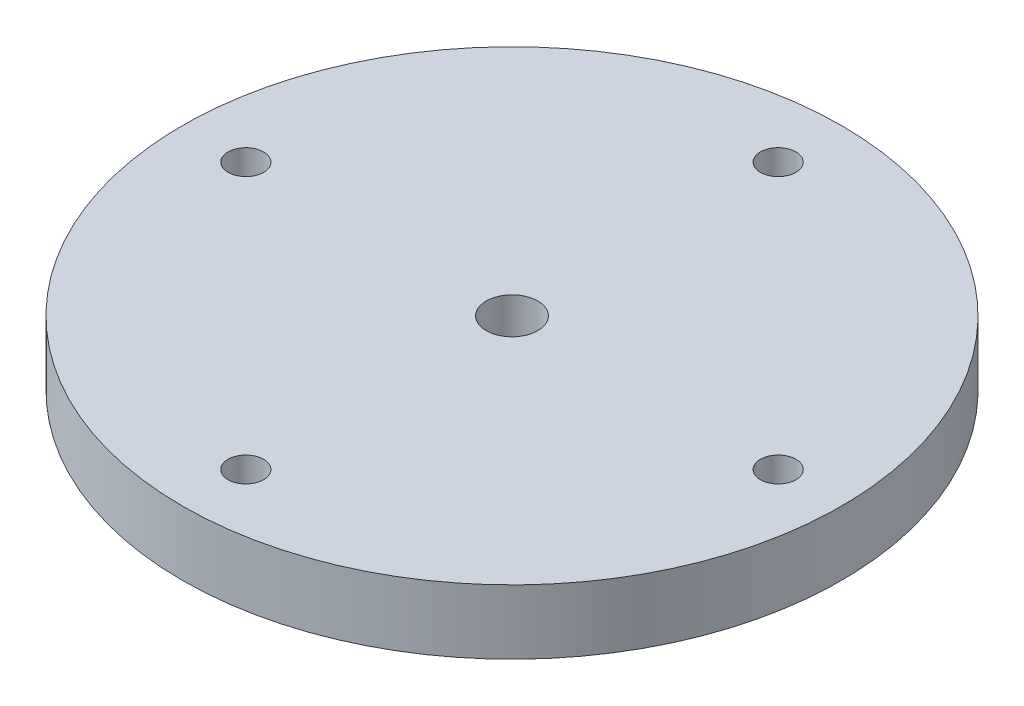
ISO-10303-21;
HEADER;
FILE_DESCRIPTION(('STEP AP214'),'2;1');
FILE_NAME('part.step','',(''),(''),'','','');
FILE_SCHEMA(('AUTOMOTIVE_DESIGN { 1 0 10303 214 1 1 1 1 }'));
ENDSEC;
DATA;
#1=APPLICATION_CONTEXT('core data for automotive mechanical design processes');
#2=APPLICATION_PROTOCOL_DEFINITION('international standard','automotive_design',2000,#1);
#3=PRODUCT_CONTEXT('',#1,'mechanical');
#4=PRODUCT('Part','Part','',(#3));
#5=PRODUCT_RELATED_PRODUCT_CATEGORY('part','',(#4));
#6=PRODUCT_DEFINITION_FORMATION('','',#4);
#7=PRODUCT_DEFINITION_CONTEXT('part definition',#1,'design');
#8=PRODUCT_DEFINITION('design','',#6,#7);
#9=PRODUCT_DEFINITION_SHAPE('','',#8);
#10=(LENGTH_UNIT() NAMED_UNIT(*) SI_UNIT(.MILLI.,.METRE.));
#11=(NAMED_UNIT(*) PLANE_ANGLE_UNIT() SI_UNIT($,.RADIAN.));
#12=(NAMED_UNIT(*) SI_UNIT($,.STERADIAN.) SOLID_ANGLE_UNIT());
#13=UNCERTAINTY_MEASURE_WITH_UNIT(LENGTH_MEASURE(1.E-05),#10,'distance_accuracy_value','');
#14=(GEOMETRIC_REPRESENTATION_CONTEXT(3) GLOBAL_UNCERTAINTY_ASSIGNED_CONTEXT((#13)) GLOBAL_UNIT_ASSIGNED_CONTEXT((#10,
#11,#12)) REPRESENTATION_CONTEXT('',''));
#15=CARTESIAN_POINT('',(0.,0.,0.));
#16=DIRECTION('',(0.,0.,1.));
#17=DIRECTION('',(1.,0.,0.));
#18=AXIS2_PLACEMENT_3D('',#15,#16,#17);
#19=CARTESIAN_POINT('',(0.,6.35,0.));
#20=DIRECTION('',(0.,-1.,0.));
#21=DIRECTION('',(0.,0.,-1.));
#22=AXIS2_PLACEMENT_3D('',#19,#20,#21);
#23=CYLINDRICAL_SURFACE('',#22,32.5);
#24=CARTESIAN_POINT('',(0.,6.35,0.));
#25=DIRECTION('',(0.,1.,0.));
#26=DIRECTION('',(0.,0.,1.));
#27=AXIS2_PLACEMENT_3D('',#24,#25,#26);
#28=CIRCLE('',#27,32.5);
#29=CARTESIAN_POINT('',(0.,6.35,32.5));
#30=VERTEX_POINT('',#29);
#31=EDGE_CURVE('E10',#30,#30,#28,.T.);
#32=ORIENTED_EDGE('',*,*,#31,.F.);
#33=EDGE_LOOP('',(#32));
#34=FACE_BOUND('',#33,.T.);
#35=CARTESIAN_POINT('',(0.,0.,0.));
#36=DIRECTION('',(0.,1.,0.));
#37=DIRECTION('',(0.,0.,1.));
#38=AXIS2_PLACEMENT_3D('',#35,#36,#37);
#39=CIRCLE('',#38,32.5);
#40=CARTESIAN_POINT('',(0.,0.,32.5));
#41=VERTEX_POINT('',#40);
#42=EDGE_CURVE('E39',#41,#41,#39,.T.);
#43=ORIENTED_EDGE('',*,*,#42,.T.);
#44=EDGE_LOOP('',(#43));
#45=FACE_BOUND('',#44,.T.);
#46=ADVANCED_FACE('F36',(#34,#45),#23,.T.);
#47=CARTESIAN_POINT('',(0.,6.35,0.));
#48=DIRECTION('',(0.,1.,0.));
#49=DIRECTION('',(0.,0.,1.));
#50=AXIS2_PLACEMENT_3D('',#47,#48,#49);
#51=PLANE('',#50);
#52=CARTESIAN_POINT('',(0.,6.35,26.25));
#53=DIRECTION('',(0.,1.,0.));
#54=DIRECTION('',(0.,0.,1.));
#55=AXIS2_PLACEMENT_3D('',#52,#53,#54);
#56=CIRCLE('',#55,1.75);
#57=CARTESIAN_POINT('',(0.,6.35,28.));
#58=VERTEX_POINT('',#57);
#59=EDGE_CURVE('E72',#58,#58,#56,.T.);
#60=ORIENTED_EDGE('',*,*,#59,.F.);
#61=EDGE_LOOP('',(#60));
#62=FACE_BOUND('',#61,.T.);
#63=CARTESIAN_POINT('',(26.25,6.35,0.));
#64=DIRECTION('',(0.,1.,0.));
#65=DIRECTION('',(0.,0.,1.));
#66=AXIS2_PLACEMENT_3D('',#63,#64,#65);
#67=CIRCLE('',#66,1.75);
#68=CARTESIAN_POINT('',(26.25,6.35,1.75));
#69=VERTEX_POINT('',#68);
#70=EDGE_CURVE('E66',#69,#69,#67,.T.);
#71=ORIENTED_EDGE('',*,*,#70,.F.);
#72=EDGE_LOOP('',(#71));
#73=FACE_BOUND('',#72,.T.);
#74=CARTESIAN_POINT('',(0.,6.35,-26.25));
#75=DIRECTION('',(0.,1.,0.));
#76=DIRECTION('',(0.,0.,1.));
#77=AXIS2_PLACEMENT_3D('',#74,#75,#76);
#78=CIRCLE('',#77,1.75);
#79=CARTESIAN_POINT('',(0.,6.35,-24.5));
#80=VERTEX_POINT('',#79);
#81=EDGE_CURVE('E60',#80,#80,#78,.T.);
#82=ORIENTED_EDGE('',*,*,#81,.F.);
#83=EDGE_LOOP('',(#82));
#84=FACE_BOUND('',#83,.T.);
#85=CARTESIAN_POINT('',(-26.25,6.35,0.));
#86=DIRECTION('',(0.,1.,0.));
#87=DIRECTION('',(0.,0.,1.));
#88=AXIS2_PLACEMENT_3D('',#85,#86,#87);
#89=CIRCLE('',#88,1.75);
#90=CARTESIAN_POINT('',(-26.25,6.35,1.75));
#91=VERTEX_POINT('',#90);
#92=EDGE_CURVE('E54',#91,#91,#89,.T.);
#93=ORIENTED_EDGE('',*,*,#92,.F.);
#94=EDGE_LOOP('',(#93));
#95=FACE_BOUND('',#94,.T.);
#96=CARTESIAN_POINT('',(0.,6.35,0.));
#97=DIRECTION('',(0.,1.,0.));
#98=DIRECTION('',(0.,0.,1.));
#99=AXIS2_PLACEMENT_3D('',#96,#97,#98);
#100=CIRCLE('',#99,2.54);
#101=CARTESIAN_POINT('',(0.,6.35,2.54));
#102=VERTEX_POINT('',#101);
#103=EDGE_CURVE('E48',#102,#102,#100,.T.);
#104=ORIENTED_EDGE('',*,*,#103,.F.);
#105=EDGE_LOOP('',(#104));
#106=FACE_BOUND('',#105,.T.);
#107=ORIENTED_EDGE('',*,*,#31,.T.);
#108=EDGE_LOOP('',(#107));
#109=FACE_BOUND('',#108,.T.);
#110=ADVANCED_FACE('F88',(#62,#73,#84,#95,#106,#109),#51,.T.);
#111=CARTESIAN_POINT('',(0.,0.,0.));
#112=DIRECTION('',(0.,1.,0.));
#113=DIRECTION('',(0.,0.,1.));
#114=AXIS2_PLACEMENT_3D('',#111,#112,#113);
#115=PLANE('',#114);
#116=CARTESIAN_POINT('',(0.,0.,26.25));
#117=DIRECTION('',(0.,1.,0.));
#118=DIRECTION('',(0.,0.,1.));
#119=AXIS2_PLACEMENT_3D('',#116,#117,#118);
#120=CIRCLE('',#119,1.75);
#121=CARTESIAN_POINT('',(0.,0.,28.));
#122=VERTEX_POINT('',#121);
#123=EDGE_CURVE('E51',#122,#122,#120,.T.);
#124=ORIENTED_EDGE('',*,*,#123,.T.);
#125=EDGE_LOOP('',(#124));
#126=FACE_BOUND('',#125,.T.);
#127=CARTESIAN_POINT('',(26.25,0.,0.));
#128=DIRECTION('',(0.,1.,0.));
#129=DIRECTION('',(0.,0.,1.));
#130=AXIS2_PLACEMENT_3D('',#127,#128,#129);
#131=CIRCLE('',#130,1.75);
#132=CARTESIAN_POINT('',(26.25,0.,1.75));
#133=VERTEX_POINT('',#132);
#134=EDGE_CURVE('E69',#133,#133,#131,.T.);
#135=ORIENTED_EDGE('',*,*,#134,.T.);
#136=EDGE_LOOP('',(#135));
#137=FACE_BOUND('',#136,.T.);
#138=CARTESIAN_POINT('',(0.,0.,-26.25));
#139=DIRECTION('',(0.,1.,0.));
#140=DIRECTION('',(0.,0.,1.));
#141=AXIS2_PLACEMENT_3D('',#138,#139,#140);
#142=CIRCLE('',#141,1.75);
#143=CARTESIAN_POINT('',(0.,0.,-24.5));
#144=VERTEX_POINT('',#143);
#145=EDGE_CURVE('E63',#144,#144,#142,.T.);
#146=ORIENTED_EDGE('',*,*,#145,.T.);
#147=EDGE_LOOP('',(#146));
#148=FACE_BOUND('',#147,.T.);
#149=CARTESIAN_POINT('',(-26.25,0.,0.));
#150=DIRECTION('',(0.,1.,0.));
#151=DIRECTION('',(0.,0.,1.));
#152=AXIS2_PLACEMENT_3D('',#149,#150,#151);
#153=CIRCLE('',#152,1.75);
#154=CARTESIAN_POINT('',(-26.25,0.,1.75));
#155=VERTEX_POINT('',#154);
#156=EDGE_CURVE('E57',#155,#155,#153,.T.);
#157=ORIENTED_EDGE('',*,*,#156,.T.);
#158=EDGE_LOOP('',(#157));
#159=FACE_BOUND('',#158,.T.);
#160=CARTESIAN_POINT('',(0.,0.,0.));
#161=DIRECTION('',(0.,1.,0.));
#162=DIRECTION('',(0.,0.,1.));
#163=AXIS2_PLACEMENT_3D('',#160,#161,#162);
#164=CIRCLE('',#163,2.54);
#165=CARTESIAN_POINT('',(0.,0.,2.54));
#166=VERTEX_POINT('',#165);
#167=EDGE_CURVE('E46',#166,#166,#164,.T.);
#168=ORIENTED_EDGE('',*,*,#167,.T.);
#169=EDGE_LOOP('',(#168));
#170=FACE_BOUND('',#169,.T.);
#171=ORIENTED_EDGE('',*,*,#42,.F.);
#172=EDGE_LOOP('',(#171));
#173=FACE_BOUND('',#172,.T.);
#174=ADVANCED_FACE('F78',(#126,#137,#148,#159,#170,#173),#115,.F.);
#175=CARTESIAN_POINT('',(0.,0.,0.));
#176=DIRECTION('',(0.,1.,0.));
#177=DIRECTION('',(0.,0.,1.));
#178=AXIS2_PLACEMENT_3D('',#175,#176,#177);
#179=CYLINDRICAL_SURFACE('',#178,2.54);
#180=ORIENTED_EDGE('',*,*,#167,.F.);
#181=EDGE_LOOP('',(#180));
#182=FACE_BOUND('',#181,.T.);
#183=ORIENTED_EDGE('',*,*,#103,.T.);
#184=EDGE_LOOP('',(#183));
#185=FACE_BOUND('',#184,.T.);
#186=ADVANCED_FACE('F100',(#182,#185),#179,.F.);
#187=CARTESIAN_POINT('',(-26.25,0.,0.));
#188=DIRECTION('',(0.,1.,0.));
#189=DIRECTION('',(0.,0.,1.));
#190=AXIS2_PLACEMENT_3D('',#187,#188,#189);
#191=CYLINDRICAL_SURFACE('',#190,1.75);
#192=ORIENTED_EDGE('',*,*,#156,.F.);
#193=EDGE_LOOP('',(#192));
#194=FACE_BOUND('',#193,.T.);
#195=ORIENTED_EDGE('',*,*,#92,.T.);
#196=EDGE_LOOP('',(#195));
#197=FACE_BOUND('',#196,.T.);
#198=ADVANCED_FACE('F102',(#194,#197),#191,.F.);
#199=CARTESIAN_POINT('',(0.,0.,-26.25));
#200=DIRECTION('',(0.,1.,0.));
#201=DIRECTION('',(0.,0.,1.));
#202=AXIS2_PLACEMENT_3D('',#199,#200,#201);
#203=CYLINDRICAL_SURFACE('',#202,1.75);
#204=ORIENTED_EDGE('',*,*,#145,.F.);
#205=EDGE_LOOP('',(#204));
#206=FACE_BOUND('',#205,.T.);
#207=ORIENTED_EDGE('',*,*,#81,.T.);
#208=EDGE_LOOP('',(#207));
#209=FACE_BOUND('',#208,.T.);
#210=ADVANCED_FACE('F109',(#206,#209),#203,.F.);
#211=CARTESIAN_POINT('',(26.25,0.,0.));
#212=DIRECTION('',(0.,1.,0.));
#213=DIRECTION('',(0.,0.,1.));
#214=AXIS2_PLACEMENT_3D('',#211,#212,#213);
#215=CYLINDRICAL_SURFACE('',#214,1.75);
#216=ORIENTED_EDGE('',*,*,#134,.F.);
#217=EDGE_LOOP('',(#216));
#218=FACE_BOUND('',#217,.T.);
#219=ORIENTED_EDGE('',*,*,#70,.T.);
#220=EDGE_LOOP('',(#219));
#221=FACE_BOUND('',#220,.T.);
#222=ADVANCED_FACE('F84',(#218,#221),#215,.F.);
#223=CARTESIAN_POINT('',(0.,0.,26.25));
#224=DIRECTION('',(0.,1.,0.));
#225=DIRECTION('',(0.,0.,1.));
#226=AXIS2_PLACEMENT_3D('',#223,#224,#225);
#227=CYLINDRICAL_SURFACE('',#226,1.75);
#228=ORIENTED_EDGE('',*,*,#123,.F.);
#229=EDGE_LOOP('',(#228));
#230=FACE_BOUND('',#229,.T.);
#231=ORIENTED_EDGE('',*,*,#59,.T.);
#232=EDGE_LOOP('',(#231));
#233=FACE_BOUND('',#232,.T.);
#234=ADVANCED_FACE('F81',(#230,#233),#227,.F.);
#235=CLOSED_SHELL('',(#46,#110,#174,#186,#198,#210,#222,#234));
#236=MANIFOLD_SOLID_BREP('B2',#235);
#237=ADVANCED_BREP_SHAPE_REPRESENTATION('',(#18,#236),#14);
#238=SHAPE_DEFINITION_REPRESENTATION(#9,#237);
ENDSEC;
END-ISO-10303-21;
